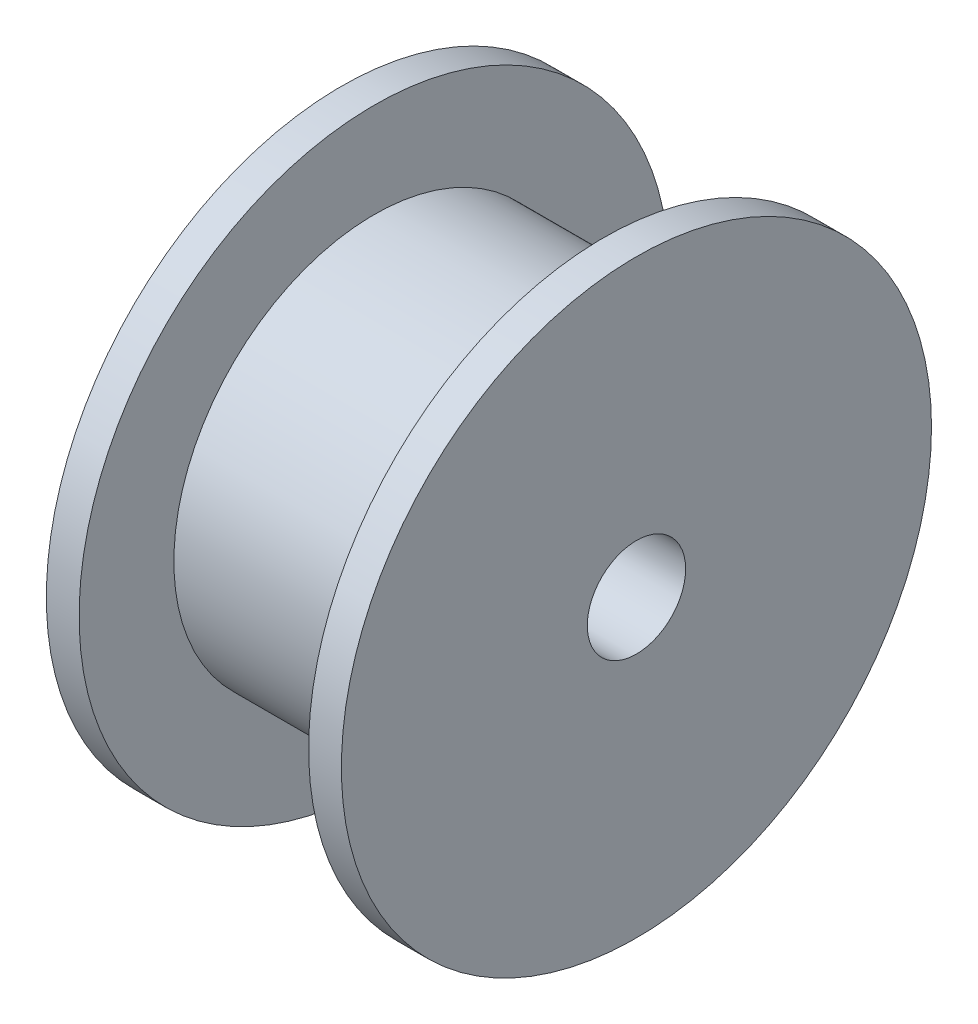
ISO-10303-21;
HEADER;
FILE_DESCRIPTION(('STEP AP214'),'2;1');
FILE_NAME('part.step','',(''),(''),'','','');
FILE_SCHEMA(('AUTOMOTIVE_DESIGN { 1 0 10303 214 1 1 1 1 }'));
ENDSEC;
DATA;
#1=APPLICATION_CONTEXT('core data for automotive mechanical design processes');
#2=APPLICATION_PROTOCOL_DEFINITION('international standard','automotive_design',2000,#1);
#3=PRODUCT_CONTEXT('',#1,'mechanical');
#4=PRODUCT('Part','Part','',(#3));
#5=PRODUCT_RELATED_PRODUCT_CATEGORY('part','',(#4));
#6=PRODUCT_DEFINITION_FORMATION('','',#4);
#7=PRODUCT_DEFINITION_CONTEXT('part definition',#1,'design');
#8=PRODUCT_DEFINITION('design','',#6,#7);
#9=PRODUCT_DEFINITION_SHAPE('','',#8);
#10=(LENGTH_UNIT() NAMED_UNIT(*) SI_UNIT(.MILLI.,.METRE.));
#11=(NAMED_UNIT(*) PLANE_ANGLE_UNIT() SI_UNIT($,.RADIAN.));
#12=(NAMED_UNIT(*) SI_UNIT($,.STERADIAN.) SOLID_ANGLE_UNIT());
#13=UNCERTAINTY_MEASURE_WITH_UNIT(LENGTH_MEASURE(1.E-05),#10,'distance_accuracy_value','');
#14=(GEOMETRIC_REPRESENTATION_CONTEXT(3) GLOBAL_UNCERTAINTY_ASSIGNED_CONTEXT((#13)) GLOBAL_UNIT_ASSIGNED_CONTEXT((#10,
#11,#12)) REPRESENTATION_CONTEXT('',''));
#15=CARTESIAN_POINT('',(0.,0.,0.));
#16=DIRECTION('',(0.,0.,1.));
#17=DIRECTION('',(1.,0.,0.));
#18=AXIS2_PLACEMENT_3D('',#15,#16,#17);
#19=CARTESIAN_POINT('',(0.,0.,0.));
#20=DIRECTION('',(1.,0.,0.));
#21=DIRECTION('',(0.,0.,-1.));
#22=AXIS2_PLACEMENT_3D('',#19,#20,#21);
#23=CYLINDRICAL_SURFACE('',#22,1.5);
#24=CARTESIAN_POINT('',(0.,0.,0.));
#25=DIRECTION('',(1.,0.,0.));
#26=DIRECTION('',(0.,0.,-1.));
#27=AXIS2_PLACEMENT_3D('',#24,#25,#26);
#28=CIRCLE('',#27,1.5);
#29=CARTESIAN_POINT('',(0.,0.,-1.5));
#30=VERTEX_POINT('',#29);
#31=EDGE_CURVE('E18',#30,#30,#28,.F.);
#32=ORIENTED_EDGE('',*,*,#31,.T.);
#33=EDGE_LOOP('',(#32));
#34=FACE_BOUND('',#33,.T.);
#35=CARTESIAN_POINT('',(9.,0.,0.));
#36=DIRECTION('',(1.,0.,0.));
#37=DIRECTION('',(0.,0.,-1.));
#38=AXIS2_PLACEMENT_3D('',#35,#36,#37);
#39=CIRCLE('',#38,1.5);
#40=CARTESIAN_POINT('',(9.,0.,-1.5));
#41=VERTEX_POINT('',#40);
#42=EDGE_CURVE('E40',#41,#41,#39,.F.);
#43=ORIENTED_EDGE('',*,*,#42,.F.);
#44=EDGE_LOOP('',(#43));
#45=FACE_BOUND('',#44,.T.);
#46=ADVANCED_FACE('F15',(#34,#45),#23,.F.);
#47=CARTESIAN_POINT('',(0.,0.,0.));
#48=DIRECTION('',(1.,0.,0.));
#49=DIRECTION('',(0.,0.,-1.));
#50=AXIS2_PLACEMENT_3D('',#47,#48,#49);
#51=PLANE('',#50);
#52=ORIENTED_EDGE('',*,*,#31,.F.);
#53=EDGE_LOOP('',(#52));
#54=FACE_BOUND('',#53,.T.);
#55=CARTESIAN_POINT('',(0.,0.,0.));
#56=DIRECTION('',(1.,0.,0.));
#57=DIRECTION('',(0.,0.,-1.));
#58=AXIS2_PLACEMENT_3D('',#55,#56,#57);
#59=CIRCLE('',#58,9.);
#60=CARTESIAN_POINT('',(0.,0.,-9.));
#61=VERTEX_POINT('',#60);
#62=EDGE_CURVE('E38',#61,#61,#59,.T.);
#63=ORIENTED_EDGE('',*,*,#62,.F.);
#64=EDGE_LOOP('',(#63));
#65=FACE_BOUND('',#64,.T.);
#66=ADVANCED_FACE('F49',(#54,#65),#51,.F.);
#67=CARTESIAN_POINT('',(9.,0.,0.));
#68=DIRECTION('',(1.,0.,0.));
#69=DIRECTION('',(0.,0.,-1.));
#70=AXIS2_PLACEMENT_3D('',#67,#68,#69);
#71=PLANE('',#70);
#72=ORIENTED_EDGE('',*,*,#42,.T.);
#73=EDGE_LOOP('',(#72));
#74=FACE_BOUND('',#73,.T.);
#75=CARTESIAN_POINT('',(9.,0.,0.));
#76=DIRECTION('',(1.,0.,0.));
#77=DIRECTION('',(0.,0.,-1.));
#78=AXIS2_PLACEMENT_3D('',#75,#76,#77);
#79=CIRCLE('',#78,9.);
#80=CARTESIAN_POINT('',(9.,0.,-9.));
#81=VERTEX_POINT('',#80);
#82=EDGE_CURVE('E35',#81,#81,#79,.F.);
#83=ORIENTED_EDGE('',*,*,#82,.F.);
#84=EDGE_LOOP('',(#83));
#85=FACE_BOUND('',#84,.T.);
#86=ADVANCED_FACE('F52',(#74,#85),#71,.T.);
#87=CARTESIAN_POINT('',(0.,0.,0.));
#88=DIRECTION('',(1.,0.,0.));
#89=DIRECTION('',(0.,0.,-1.));
#90=AXIS2_PLACEMENT_3D('',#87,#88,#89);
#91=CYLINDRICAL_SURFACE('',#90,9.);
#92=ORIENTED_EDGE('',*,*,#62,.T.);
#93=EDGE_LOOP('',(#92));
#94=FACE_BOUND('',#93,.T.);
#95=CARTESIAN_POINT('',(1.,0.,0.));
#96=DIRECTION('',(1.,0.,0.));
#97=DIRECTION('',(0.,0.,-1.));
#98=AXIS2_PLACEMENT_3D('',#95,#96,#97);
#99=CIRCLE('',#98,9.);
#100=CARTESIAN_POINT('',(1.,0.,-9.));
#101=VERTEX_POINT('',#100);
#102=EDGE_CURVE('E32',#101,#101,#99,.T.);
#103=ORIENTED_EDGE('',*,*,#102,.F.);
#104=EDGE_LOOP('',(#103));
#105=FACE_BOUND('',#104,.T.);
#106=ADVANCED_FACE('F55',(#94,#105),#91,.T.);
#107=CARTESIAN_POINT('',(0.,0.,0.));
#108=DIRECTION('',(1.,0.,0.));
#109=DIRECTION('',(0.,0.,-1.));
#110=AXIS2_PLACEMENT_3D('',#107,#108,#109);
#111=CYLINDRICAL_SURFACE('',#110,9.);
#112=CARTESIAN_POINT('',(8.,0.,0.));
#113=DIRECTION('',(1.,0.,0.));
#114=DIRECTION('',(0.,0.,-1.));
#115=AXIS2_PLACEMENT_3D('',#112,#113,#114);
#116=CIRCLE('',#115,9.);
#117=CARTESIAN_POINT('',(8.,0.,-9.));
#118=VERTEX_POINT('',#117);
#119=EDGE_CURVE('E27',#118,#118,#116,.T.);
#120=ORIENTED_EDGE('',*,*,#119,.T.);
#121=EDGE_LOOP('',(#120));
#122=FACE_BOUND('',#121,.T.);
#123=ORIENTED_EDGE('',*,*,#82,.T.);
#124=EDGE_LOOP('',(#123));
#125=FACE_BOUND('',#124,.T.);
#126=ADVANCED_FACE('F58',(#122,#125),#111,.T.);
#127=CARTESIAN_POINT('',(1.,0.,0.));
#128=DIRECTION('',(1.,0.,0.));
#129=DIRECTION('',(0.,0.,-1.));
#130=AXIS2_PLACEMENT_3D('',#127,#128,#129);
#131=PLANE('',#130);
#132=CARTESIAN_POINT('',(1.,0.,0.));
#133=DIRECTION('',(1.,0.,0.));
#134=DIRECTION('',(0.,0.,-1.));
#135=AXIS2_PLACEMENT_3D('',#132,#133,#134);
#136=CIRCLE('',#135,6.11);
#137=CARTESIAN_POINT('',(1.,0.,-6.11));
#138=VERTEX_POINT('',#137);
#139=EDGE_CURVE('E22',#138,#138,#136,.T.);
#140=ORIENTED_EDGE('',*,*,#139,.F.);
#141=EDGE_LOOP('',(#140));
#142=FACE_BOUND('',#141,.T.);
#143=ORIENTED_EDGE('',*,*,#102,.T.);
#144=EDGE_LOOP('',(#143));
#145=FACE_BOUND('',#144,.T.);
#146=ADVANCED_FACE('F62',(#142,#145),#131,.T.);
#147=CARTESIAN_POINT('',(8.,0.,0.));
#148=DIRECTION('',(1.,0.,0.));
#149=DIRECTION('',(0.,0.,-1.));
#150=AXIS2_PLACEMENT_3D('',#147,#148,#149);
#151=PLANE('',#150);
#152=CARTESIAN_POINT('',(8.,0.,0.));
#153=DIRECTION('',(1.,0.,0.));
#154=DIRECTION('',(0.,0.,-1.));
#155=AXIS2_PLACEMENT_3D('',#152,#153,#154);
#156=CIRCLE('',#155,6.11);
#157=CARTESIAN_POINT('',(8.,0.,-6.11));
#158=VERTEX_POINT('',#157);
#159=EDGE_CURVE('E10',#158,#158,#156,.F.);
#160=ORIENTED_EDGE('',*,*,#159,.F.);
#161=EDGE_LOOP('',(#160));
#162=FACE_BOUND('',#161,.T.);
#163=ORIENTED_EDGE('',*,*,#119,.F.);
#164=EDGE_LOOP('',(#163));
#165=FACE_BOUND('',#164,.T.);
#166=ADVANCED_FACE('F64',(#162,#165),#151,.F.);
#167=CARTESIAN_POINT('',(1.,0.,0.));
#168=DIRECTION('',(1.,0.,0.));
#169=DIRECTION('',(0.,0.,-1.));
#170=AXIS2_PLACEMENT_3D('',#167,#168,#169);
#171=CYLINDRICAL_SURFACE('',#170,6.11);
#172=ORIENTED_EDGE('',*,*,#159,.T.);
#173=EDGE_LOOP('',(#172));
#174=FACE_BOUND('',#173,.T.);
#175=ORIENTED_EDGE('',*,*,#139,.T.);
#176=EDGE_LOOP('',(#175));
#177=FACE_BOUND('',#176,.T.);
#178=ADVANCED_FACE('F72',(#174,#177),#171,.T.);
#179=CLOSED_SHELL('',(#46,#66,#86,#106,#126,#146,#166,#178));
#180=MANIFOLD_SOLID_BREP('B1',#179);
#181=ADVANCED_BREP_SHAPE_REPRESENTATION('',(#18,#180),#14);
#182=SHAPE_DEFINITION_REPRESENTATION(#9,#181);
ENDSEC;
END-ISO-10303-21;
